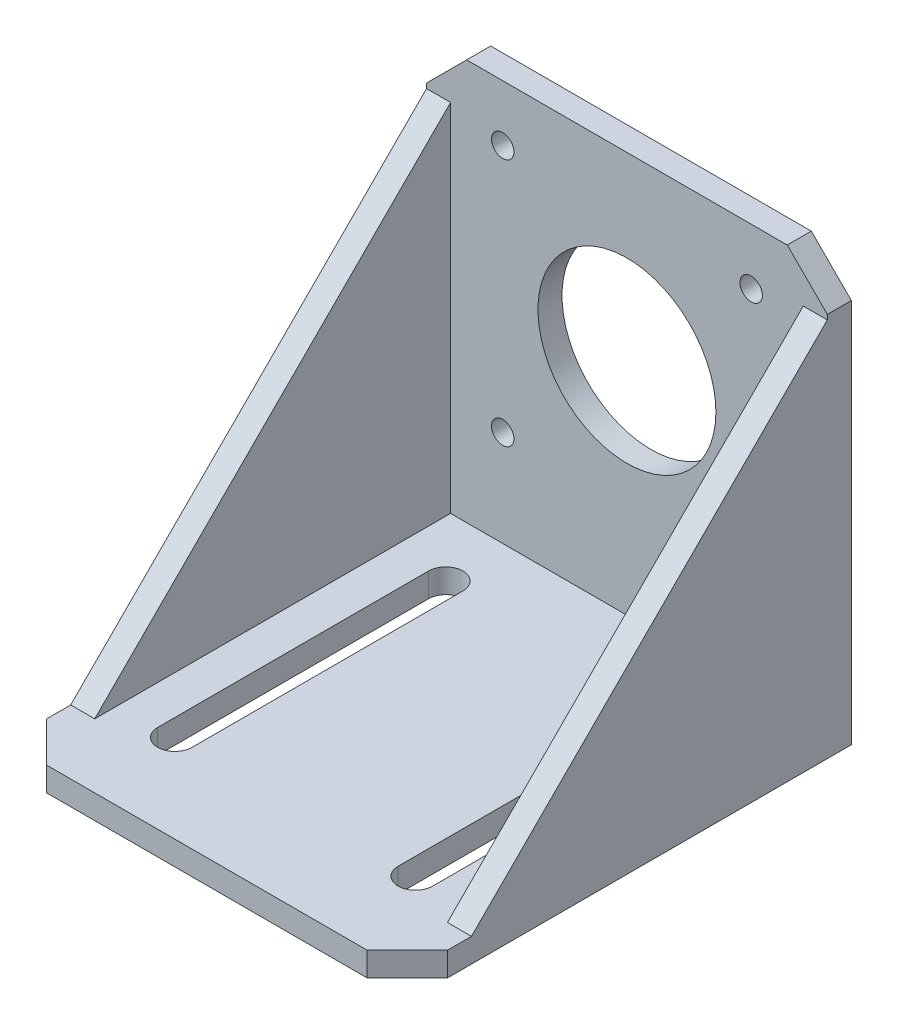
ISO-10303-21;
HEADER;
FILE_DESCRIPTION(('STEP AP214'),'2;1');
FILE_NAME('part.step','',(''),(''),'','','');
FILE_SCHEMA(('AUTOMOTIVE_DESIGN { 1 0 10303 214 1 1 1 1 }'));
ENDSEC;
DATA;
#1=APPLICATION_CONTEXT('core data for automotive mechanical design processes');
#2=APPLICATION_PROTOCOL_DEFINITION('international standard','automotive_design',2000,#1);
#3=PRODUCT_CONTEXT('',#1,'mechanical');
#4=PRODUCT('Part','Part','',(#3));
#5=PRODUCT_RELATED_PRODUCT_CATEGORY('part','',(#4));
#6=PRODUCT_DEFINITION_FORMATION('','',#4);
#7=PRODUCT_DEFINITION_CONTEXT('part definition',#1,'design');
#8=PRODUCT_DEFINITION('design','',#6,#7);
#9=PRODUCT_DEFINITION_SHAPE('','',#8);
#10=(LENGTH_UNIT() NAMED_UNIT(*) SI_UNIT(.MILLI.,.METRE.));
#11=(NAMED_UNIT(*) PLANE_ANGLE_UNIT() SI_UNIT($,.RADIAN.));
#12=(NAMED_UNIT(*) SI_UNIT($,.STERADIAN.) SOLID_ANGLE_UNIT());
#13=UNCERTAINTY_MEASURE_WITH_UNIT(LENGTH_MEASURE(1.E-05),#10,'distance_accuracy_value','');
#14=(GEOMETRIC_REPRESENTATION_CONTEXT(3) GLOBAL_UNCERTAINTY_ASSIGNED_CONTEXT((#13)) GLOBAL_UNIT_ASSIGNED_CONTEXT((#10,
#11,#12)) REPRESENTATION_CONTEXT('',''));
#15=CARTESIAN_POINT('',(0.,0.,0.));
#16=DIRECTION('',(0.,0.,1.));
#17=DIRECTION('',(1.,0.,0.));
#18=AXIS2_PLACEMENT_3D('',#15,#16,#17);
#19=CARTESIAN_POINT('',(0.,0.,3.));
#20=DIRECTION('',(0.,0.,1.));
#21=DIRECTION('',(1.,0.,0.));
#22=AXIS2_PLACEMENT_3D('',#19,#20,#21);
#23=PLANE('',#22);
#24=CARTESIAN_POINT('',(0.,0.,3.));
#25=DIRECTION('',(0.,0.,1.));
#26=DIRECTION('',(1.,0.,0.));
#27=AXIS2_PLACEMENT_3D('',#24,#25,#26);
#28=CIRCLE('',#27,11.1);
#29=CARTESIAN_POINT('',(11.1,0.,3.));
#30=VERTEX_POINT('',#29);
#31=EDGE_CURVE('E414',#30,#30,#28,.T.);
#32=ORIENTED_EDGE('',*,*,#31,.F.);
#33=EDGE_LOOP('',(#32));
#34=FACE_BOUND('',#33,.T.);
#35=CARTESIAN_POINT('',(-15.5,15.5,3.));
#36=DIRECTION('',(0.,0.,1.));
#37=DIRECTION('',(1.,0.,0.));
#38=AXIS2_PLACEMENT_3D('',#35,#36,#37);
#39=CIRCLE('',#38,1.4);
#40=CARTESIAN_POINT('',(-14.1,15.5,3.));
#41=VERTEX_POINT('',#40);
#42=EDGE_CURVE('E523',#41,#41,#39,.T.);
#43=ORIENTED_EDGE('',*,*,#42,.F.);
#44=EDGE_LOOP('',(#43));
#45=FACE_BOUND('',#44,.T.);
#46=CARTESIAN_POINT('',(15.5,15.5,3.));
#47=DIRECTION('',(0.,0.,1.));
#48=DIRECTION('',(1.,0.,0.));
#49=AXIS2_PLACEMENT_3D('',#46,#47,#48);
#50=CIRCLE('',#49,1.4);
#51=CARTESIAN_POINT('',(16.9,15.5,3.));
#52=VERTEX_POINT('',#51);
#53=EDGE_CURVE('E529',#52,#52,#50,.T.);
#54=ORIENTED_EDGE('',*,*,#53,.F.);
#55=EDGE_LOOP('',(#54));
#56=FACE_BOUND('',#55,.T.);
#57=CARTESIAN_POINT('',(15.5,-15.5,3.));
#58=DIRECTION('',(0.,0.,1.));
#59=DIRECTION('',(1.,0.,0.));
#60=AXIS2_PLACEMENT_3D('',#57,#58,#59);
#61=CIRCLE('',#60,1.4);
#62=CARTESIAN_POINT('',(16.9,-15.5,3.));
#63=VERTEX_POINT('',#62);
#64=EDGE_CURVE('E540',#63,#63,#61,.T.);
#65=ORIENTED_EDGE('',*,*,#64,.F.);
#66=EDGE_LOOP('',(#65));
#67=FACE_BOUND('',#66,.T.);
#68=CARTESIAN_POINT('',(-15.5,-15.5,3.));
#69=DIRECTION('',(0.,0.,1.));
#70=DIRECTION('',(1.,0.,0.));
#71=AXIS2_PLACEMENT_3D('',#68,#69,#70);
#72=CIRCLE('',#71,1.4);
#73=CARTESIAN_POINT('',(-14.1,-15.5,3.));
#74=VERTEX_POINT('',#73);
#75=EDGE_CURVE('E279',#74,#74,#72,.T.);
#76=ORIENTED_EDGE('',*,*,#75,.F.);
#77=EDGE_LOOP('',(#76));
#78=FACE_BOUND('',#77,.T.);
#79=DIRECTION('',(0.,-1.,0.));
#80=VECTOR('',#79,1.);
#81=CARTESIAN_POINT('',(22.,16.8999999999994,3.));
#82=LINE('',#81,#80);
#83=CARTESIAN_POINT('',(22.,16.8999999999994,3.));
#84=VERTEX_POINT('',#83);
#85=CARTESIAN_POINT('',(22.,-27.5,3.));
#86=VERTEX_POINT('',#85);
#87=EDGE_CURVE('E51',#84,#86,#82,.T.);
#88=ORIENTED_EDGE('',*,*,#87,.F.);
#89=DIRECTION('',(1.,0.,0.));
#90=VECTOR('',#89,1.);
#91=CARTESIAN_POINT('',(22.,16.8999999999994,3.));
#92=LINE('',#91,#90);
#93=CARTESIAN_POINT('',(25.,16.8999999999994,3.));
#94=VERTEX_POINT('',#93);
#95=EDGE_CURVE('E56',#84,#94,#92,.T.);
#96=ORIENTED_EDGE('',*,*,#95,.T.);
#97=DIRECTION('',(0.,1.,0.));
#98=VECTOR('',#97,1.);
#99=CARTESIAN_POINT('',(25.,17.5,3.));
#100=LINE('',#99,#98);
#101=CARTESIAN_POINT('',(25.,17.5,3.));
#102=VERTEX_POINT('',#101);
#103=EDGE_CURVE('E37',#94,#102,#100,.T.);
#104=ORIENTED_EDGE('',*,*,#103,.T.);
#105=DIRECTION('',(-0.707106781186549,0.707106781186546,0.));
#106=VECTOR('',#105,1.);
#107=CARTESIAN_POINT('',(20.,22.5,3.));
#108=LINE('',#107,#106);
#109=CARTESIAN_POINT('',(20.,22.5,3.));
#110=VERTEX_POINT('',#109);
#111=EDGE_CURVE('E406',#102,#110,#108,.T.);
#112=ORIENTED_EDGE('',*,*,#111,.T.);
#113=DIRECTION('',(-1.,0.,0.));
#114=VECTOR('',#113,1.);
#115=CARTESIAN_POINT('',(20.,22.5,3.));
#116=LINE('',#115,#114);
#117=CARTESIAN_POINT('',(-20.,22.5,3.));
#118=VERTEX_POINT('',#117);
#119=EDGE_CURVE('E408',#110,#118,#116,.T.);
#120=ORIENTED_EDGE('',*,*,#119,.T.);
#121=DIRECTION('',(-0.707106781186549,-0.707106781186546,0.));
#122=VECTOR('',#121,1.);
#123=CARTESIAN_POINT('',(-20.,22.5,3.));
#124=LINE('',#123,#122);
#125=CARTESIAN_POINT('',(-25.,17.5,3.));
#126=VERTEX_POINT('',#125);
#127=EDGE_CURVE('E400',#118,#126,#124,.T.);
#128=ORIENTED_EDGE('',*,*,#127,.T.);
#129=DIRECTION('',(0.,-1.,0.));
#130=VECTOR('',#129,1.);
#131=CARTESIAN_POINT('',(-25.,17.5,3.));
#132=LINE('',#131,#130);
#133=CARTESIAN_POINT('',(-25.,16.8999999999994,3.));
#134=VERTEX_POINT('',#133);
#135=EDGE_CURVE('E204',#126,#134,#132,.T.);
#136=ORIENTED_EDGE('',*,*,#135,.T.);
#137=DIRECTION('',(-1.,0.,0.));
#138=VECTOR('',#137,1.);
#139=CARTESIAN_POINT('',(-22.,16.8999999999994,3.));
#140=LINE('',#139,#138);
#141=CARTESIAN_POINT('',(-22.,16.8999999999994,3.));
#142=VERTEX_POINT('',#141);
#143=EDGE_CURVE('E196',#142,#134,#140,.T.);
#144=ORIENTED_EDGE('',*,*,#143,.F.);
#145=DIRECTION('',(0.,-1.,0.));
#146=VECTOR('',#145,1.);
#147=CARTESIAN_POINT('',(-22.,16.8999999999994,3.));
#148=LINE('',#147,#146);
#149=CARTESIAN_POINT('',(-22.,-27.5,3.));
#150=VERTEX_POINT('',#149);
#151=EDGE_CURVE('E186',#142,#150,#148,.T.);
#152=ORIENTED_EDGE('',*,*,#151,.T.);
#153=DIRECTION('',(-1.,0.,0.));
#154=VECTOR('',#153,1.);
#155=CARTESIAN_POINT('',(-25.,-27.5,3.));
#156=LINE('',#155,#154);
#157=EDGE_CURVE('E265',#86,#150,#156,.T.);
#158=ORIENTED_EDGE('',*,*,#157,.F.);
#159=EDGE_LOOP('',(#88,#96,#104,#112,#120,#128,#136,#144,#152,#158));
#160=FACE_BOUND('',#159,.T.);
#161=ADVANCED_FACE('F33',(#34,#45,#56,#67,#78,#160),#23,.T.);
#162=CARTESIAN_POINT('',(-25.,-27.5,55.4));
#163=DIRECTION('',(0.,-1.,0.));
#164=DIRECTION('',(0.,0.,-1.));
#165=AXIS2_PLACEMENT_3D('',#162,#163,#164);
#166=PLANE('',#165);
#167=DIRECTION('',(0.,0.,1.));
#168=VECTOR('',#167,1.);
#169=CARTESIAN_POINT('',(-12.85,-27.5,55.4));
#170=LINE('',#169,#168);
#171=CARTESIAN_POINT('',(-12.85,-27.5,10.6));
#172=VERTEX_POINT('',#171);
#173=CARTESIAN_POINT('',(-12.85,-27.5,44.4));
#174=VERTEX_POINT('',#173);
#175=EDGE_CURVE('E298',#172,#174,#170,.T.);
#176=ORIENTED_EDGE('',*,*,#175,.T.);
#177=CARTESIAN_POINT('',(-15.,-27.5,44.4));
#178=DIRECTION('',(0.,-1.,0.));
#179=DIRECTION('',(0.,0.,-1.));
#180=AXIS2_PLACEMENT_3D('',#177,#178,#179);
#181=CIRCLE('',#180,2.15);
#182=CARTESIAN_POINT('',(-17.15,-27.5,44.4));
#183=VERTEX_POINT('',#182);
#184=EDGE_CURVE('E301',#174,#183,#181,.T.);
#185=ORIENTED_EDGE('',*,*,#184,.T.);
#186=DIRECTION('',(0.,0.,-1.));
#187=VECTOR('',#186,1.);
#188=CARTESIAN_POINT('',(-17.15,-27.5,55.4));
#189=LINE('',#188,#187);
#190=CARTESIAN_POINT('',(-17.15,-27.5,10.6));
#191=VERTEX_POINT('',#190);
#192=EDGE_CURVE('E289',#183,#191,#189,.T.);
#193=ORIENTED_EDGE('',*,*,#192,.T.);
#194=CARTESIAN_POINT('',(-15.,-27.5,10.6));
#195=DIRECTION('',(0.,-1.,0.));
#196=DIRECTION('',(0.,0.,-1.));
#197=AXIS2_PLACEMENT_3D('',#194,#195,#196);
#198=CIRCLE('',#197,2.15);
#199=EDGE_CURVE('E295',#191,#172,#198,.T.);
#200=ORIENTED_EDGE('',*,*,#199,.T.);
#201=EDGE_LOOP('',(#176,#185,#193,#200));
#202=FACE_BOUND('',#201,.T.);
#203=DIRECTION('',(0.,0.,-1.));
#204=VECTOR('',#203,1.);
#205=CARTESIAN_POINT('',(12.85,-27.5,55.4));
#206=LINE('',#205,#204);
#207=CARTESIAN_POINT('',(12.85,-27.5,44.4));
#208=VERTEX_POINT('',#207);
#209=CARTESIAN_POINT('',(12.85,-27.5,10.6));
#210=VERTEX_POINT('',#209);
#211=EDGE_CURVE('E310',#208,#210,#206,.T.);
#212=ORIENTED_EDGE('',*,*,#211,.T.);
#213=CARTESIAN_POINT('',(15.,-27.5,10.6));
#214=DIRECTION('',(0.,-1.,0.));
#215=DIRECTION('',(0.,0.,-1.));
#216=AXIS2_PLACEMENT_3D('',#213,#214,#215);
#217=CIRCLE('',#216,2.15);
#218=CARTESIAN_POINT('',(17.15,-27.5,10.6));
#219=VERTEX_POINT('',#218);
#220=EDGE_CURVE('E43',#210,#219,#217,.T.);
#221=ORIENTED_EDGE('',*,*,#220,.T.);
#222=DIRECTION('',(0.,0.,1.));
#223=VECTOR('',#222,1.);
#224=CARTESIAN_POINT('',(17.15,-27.5,55.4));
#225=LINE('',#224,#223);
#226=CARTESIAN_POINT('',(17.15,-27.5,44.4));
#227=VERTEX_POINT('',#226);
#228=EDGE_CURVE('E304',#219,#227,#225,.T.);
#229=ORIENTED_EDGE('',*,*,#228,.T.);
#230=CARTESIAN_POINT('',(15.,-27.5,44.4));
#231=DIRECTION('',(0.,-1.,0.));
#232=DIRECTION('',(0.,0.,-1.));
#233=AXIS2_PLACEMENT_3D('',#230,#231,#232);
#234=CIRCLE('',#233,2.15);
#235=EDGE_CURVE('E307',#227,#208,#234,.T.);
#236=ORIENTED_EDGE('',*,*,#235,.T.);
#237=EDGE_LOOP('',(#212,#221,#229,#236));
#238=FACE_BOUND('',#237,.T.);
#239=DIRECTION('',(1.,0.,0.));
#240=VECTOR('',#239,1.);
#241=CARTESIAN_POINT('',(22.,-27.5,47.3999999999999));
#242=LINE('',#241,#240);
#243=CARTESIAN_POINT('',(22.,-27.5,47.3999999999999));
#244=VERTEX_POINT('',#243);
#245=CARTESIAN_POINT('',(25.,-27.5,47.3999999999999));
#246=VERTEX_POINT('',#245);
#247=EDGE_CURVE('E450',#244,#246,#242,.T.);
#248=ORIENTED_EDGE('',*,*,#247,.F.);
#249=DIRECTION('',(0.,0.,1.));
#250=VECTOR('',#249,1.);
#251=CARTESIAN_POINT('',(22.,-27.5,3.));
#252=LINE('',#251,#250);
#253=EDGE_CURVE('E453',#86,#244,#252,.T.);
#254=ORIENTED_EDGE('',*,*,#253,.F.);
#255=ORIENTED_EDGE('',*,*,#157,.T.);
#256=DIRECTION('',(0.,0.,1.));
#257=VECTOR('',#256,1.);
#258=CARTESIAN_POINT('',(-22.,-27.5,3.));
#259=LINE('',#258,#257);
#260=CARTESIAN_POINT('',(-22.,-27.5,47.3999999999999));
#261=VERTEX_POINT('',#260);
#262=EDGE_CURVE('E191',#150,#261,#259,.T.);
#263=ORIENTED_EDGE('',*,*,#262,.T.);
#264=DIRECTION('',(-1.,0.,0.));
#265=VECTOR('',#264,1.);
#266=CARTESIAN_POINT('',(-22.,-27.5,47.3999999999999));
#267=LINE('',#266,#265);
#268=CARTESIAN_POINT('',(-25.,-27.5,47.3999999999999));
#269=VERTEX_POINT('',#268);
#270=EDGE_CURVE('E199',#261,#269,#267,.T.);
#271=ORIENTED_EDGE('',*,*,#270,.T.);
#272=DIRECTION('',(0.,0.,-1.));
#273=VECTOR('',#272,1.);
#274=CARTESIAN_POINT('',(-25.,-27.5,55.4));
#275=LINE('',#274,#273);
#276=CARTESIAN_POINT('',(-25.,-27.5,50.3999999999999));
#277=VERTEX_POINT('',#276);
#278=EDGE_CURVE('E271',#277,#269,#275,.T.);
#279=ORIENTED_EDGE('',*,*,#278,.F.);
#280=DIRECTION('',(0.707106781186543,0.,0.707106781186552));
#281=VECTOR('',#280,1.);
#282=CARTESIAN_POINT('',(-22.5,-27.5,52.9));
#283=LINE('',#282,#281);
#284=CARTESIAN_POINT('',(-20.,-27.5,55.4));
#285=VERTEX_POINT('',#284);
#286=EDGE_CURVE('E262',#277,#285,#283,.T.);
#287=ORIENTED_EDGE('',*,*,#286,.T.);
#288=DIRECTION('',(-1.,0.,0.));
#289=VECTOR('',#288,1.);
#290=CARTESIAN_POINT('',(-25.,-27.5,55.4));
#291=LINE('',#290,#289);
#292=CARTESIAN_POINT('',(20.,-27.5,55.4));
#293=VERTEX_POINT('',#292);
#294=EDGE_CURVE('E269',#293,#285,#291,.T.);
#295=ORIENTED_EDGE('',*,*,#294,.F.);
#296=DIRECTION('',(0.707106781186544,0.,-0.707106781186551));
#297=VECTOR('',#296,1.);
#298=CARTESIAN_POINT('',(-2.49999999999975,-27.5,77.9));
#299=LINE('',#298,#297);
#300=CARTESIAN_POINT('',(24.9999999999999,-27.5,50.4000000000001));
#301=VERTEX_POINT('',#300);
#302=EDGE_CURVE('E215',#293,#301,#299,.T.);
#303=ORIENTED_EDGE('',*,*,#302,.T.);
#304=DIRECTION('',(0.,0.,-1.));
#305=VECTOR('',#304,1.);
#306=CARTESIAN_POINT('',(25.,-27.5,55.4));
#307=LINE('',#306,#305);
#308=EDGE_CURVE('E277',#301,#246,#307,.T.);
#309=ORIENTED_EDGE('',*,*,#308,.T.);
#310=EDGE_LOOP('',(#248,#254,#255,#263,#271,#279,#287,#295,#303,#309));
#311=FACE_BOUND('',#310,.T.);
#312=ADVANCED_FACE('F314',(#202,#238,#311),#166,.F.);
#313=CARTESIAN_POINT('',(0.,0.,0.));
#314=DIRECTION('',(0.,0.,1.));
#315=DIRECTION('',(1.,0.,0.));
#316=AXIS2_PLACEMENT_3D('',#313,#314,#315);
#317=PLANE('',#316);
#318=CARTESIAN_POINT('',(-15.5,-15.5,0.));
#319=DIRECTION('',(0.,0.,1.));
#320=DIRECTION('',(1.,0.,0.));
#321=AXIS2_PLACEMENT_3D('',#318,#319,#320);
#322=CIRCLE('',#321,1.4);
#323=CARTESIAN_POINT('',(-14.1,-15.5,0.));
#324=VERTEX_POINT('',#323);
#325=EDGE_CURVE('E274',#324,#324,#322,.T.);
#326=ORIENTED_EDGE('',*,*,#325,.T.);
#327=EDGE_LOOP('',(#326));
#328=FACE_BOUND('',#327,.T.);
#329=CARTESIAN_POINT('',(15.5,-15.5,0.));
#330=DIRECTION('',(0.,0.,1.));
#331=DIRECTION('',(1.,0.,0.));
#332=AXIS2_PLACEMENT_3D('',#329,#330,#331);
#333=CIRCLE('',#332,1.4);
#334=CARTESIAN_POINT('',(16.9,-15.5,0.));
#335=VERTEX_POINT('',#334);
#336=EDGE_CURVE('E538',#335,#335,#333,.T.);
#337=ORIENTED_EDGE('',*,*,#336,.T.);
#338=EDGE_LOOP('',(#337));
#339=FACE_BOUND('',#338,.T.);
#340=CARTESIAN_POINT('',(15.5,15.5,0.));
#341=DIRECTION('',(0.,0.,1.));
#342=DIRECTION('',(1.,0.,0.));
#343=AXIS2_PLACEMENT_3D('',#340,#341,#342);
#344=CIRCLE('',#343,1.4);
#345=CARTESIAN_POINT('',(16.9,15.5,0.));
#346=VERTEX_POINT('',#345);
#347=EDGE_CURVE('E524',#346,#346,#344,.T.);
#348=ORIENTED_EDGE('',*,*,#347,.T.);
#349=EDGE_LOOP('',(#348));
#350=FACE_BOUND('',#349,.T.);
#351=CARTESIAN_POINT('',(-15.5,15.5,0.));
#352=DIRECTION('',(0.,0.,1.));
#353=DIRECTION('',(1.,0.,0.));
#354=AXIS2_PLACEMENT_3D('',#351,#352,#353);
#355=CIRCLE('',#354,1.4);
#356=CARTESIAN_POINT('',(-14.1,15.5,0.));
#357=VERTEX_POINT('',#356);
#358=EDGE_CURVE('E520',#357,#357,#355,.T.);
#359=ORIENTED_EDGE('',*,*,#358,.T.);
#360=EDGE_LOOP('',(#359));
#361=FACE_BOUND('',#360,.T.);
#362=DIRECTION('',(-0.707106781186549,-0.707106781186546,0.));
#363=VECTOR('',#362,1.);
#364=CARTESIAN_POINT('',(-20.,22.5,0.));
#365=LINE('',#364,#363);
#366=CARTESIAN_POINT('',(-20.,22.5,0.));
#367=VERTEX_POINT('',#366);
#368=CARTESIAN_POINT('',(-25.,17.5,0.));
#369=VERTEX_POINT('',#368);
#370=EDGE_CURVE('E411',#367,#369,#365,.T.);
#371=ORIENTED_EDGE('',*,*,#370,.F.);
#372=DIRECTION('',(-1.,0.,0.));
#373=VECTOR('',#372,1.);
#374=CARTESIAN_POINT('',(20.,22.5,0.));
#375=LINE('',#374,#373);
#376=CARTESIAN_POINT('',(20.,22.5,0.));
#377=VERTEX_POINT('',#376);
#378=EDGE_CURVE('E422',#377,#367,#375,.T.);
#379=ORIENTED_EDGE('',*,*,#378,.F.);
#380=DIRECTION('',(-0.707106781186549,0.707106781186546,0.));
#381=VECTOR('',#380,1.);
#382=CARTESIAN_POINT('',(20.,22.5,0.));
#383=LINE('',#382,#381);
#384=CARTESIAN_POINT('',(25.,17.5,0.));
#385=VERTEX_POINT('',#384);
#386=EDGE_CURVE('E420',#385,#377,#383,.T.);
#387=ORIENTED_EDGE('',*,*,#386,.F.);
#388=DIRECTION('',(0.,1.,0.));
#389=VECTOR('',#388,1.);
#390=CARTESIAN_POINT('',(25.,17.5,0.));
#391=LINE('',#390,#389);
#392=CARTESIAN_POINT('',(25.,-30.5,0.));
#393=VERTEX_POINT('',#392);
#394=EDGE_CURVE('E418',#393,#385,#391,.T.);
#395=ORIENTED_EDGE('',*,*,#394,.F.);
#396=DIRECTION('',(1.,0.,0.));
#397=VECTOR('',#396,1.);
#398=CARTESIAN_POINT('',(-25.,-30.5,0.));
#399=LINE('',#398,#397);
#400=CARTESIAN_POINT('',(-25.,-30.5,0.));
#401=VERTEX_POINT('',#400);
#402=EDGE_CURVE('E416',#401,#393,#399,.T.);
#403=ORIENTED_EDGE('',*,*,#402,.F.);
#404=DIRECTION('',(0.,-1.,0.));
#405=VECTOR('',#404,1.);
#406=CARTESIAN_POINT('',(-25.,17.5,0.));
#407=LINE('',#406,#405);
#408=EDGE_CURVE('E388',#369,#401,#407,.T.);
#409=ORIENTED_EDGE('',*,*,#408,.F.);
#410=EDGE_LOOP('',(#371,#379,#387,#395,#403,#409));
#411=FACE_BOUND('',#410,.T.);
#412=CARTESIAN_POINT('',(0.,0.,0.));
#413=DIRECTION('',(0.,0.,1.));
#414=DIRECTION('',(1.,0.,0.));
#415=AXIS2_PLACEMENT_3D('',#412,#413,#414);
#416=CIRCLE('',#415,11.1);
#417=CARTESIAN_POINT('',(11.1,0.,0.));
#418=VERTEX_POINT('',#417);
#419=EDGE_CURVE('E526',#418,#418,#416,.T.);
#420=ORIENTED_EDGE('',*,*,#419,.T.);
#421=EDGE_LOOP('',(#420));
#422=FACE_BOUND('',#421,.T.);
#423=ADVANCED_FACE('F350',(#328,#339,#350,#361,#411,#422),#317,.F.);
#424=CARTESIAN_POINT('',(-20.,22.5,3.));
#425=DIRECTION('',(0.707106781186546,-0.707106781186549,0.));
#426=DIRECTION('',(0.707106781186549,0.707106781186546,0.));
#427=AXIS2_PLACEMENT_3D('',#424,#425,#426);
#428=PLANE('',#427);
#429=ORIENTED_EDGE('',*,*,#370,.T.);
#430=DIRECTION('',(0.,0.,-1.));
#431=VECTOR('',#430,1.);
#432=CARTESIAN_POINT('',(-25.,17.5,3.));
#433=LINE('',#432,#431);
#434=EDGE_CURVE('E290',#126,#369,#433,.T.);
#435=ORIENTED_EDGE('',*,*,#434,.F.);
#436=ORIENTED_EDGE('',*,*,#127,.F.);
#437=DIRECTION('',(0.,0.,-1.));
#438=VECTOR('',#437,1.);
#439=CARTESIAN_POINT('',(-20.,22.5,3.));
#440=LINE('',#439,#438);
#441=EDGE_CURVE('E410',#118,#367,#440,.T.);
#442=ORIENTED_EDGE('',*,*,#441,.T.);
#443=EDGE_LOOP('',(#429,#435,#436,#442));
#444=FACE_BOUND('',#443,.T.);
#445=ADVANCED_FACE('F35',(#444),#428,.F.);
#446=CARTESIAN_POINT('',(-25.,17.5,3.));
#447=DIRECTION('',(1.,0.,0.));
#448=DIRECTION('',(0.,1.,0.));
#449=AXIS2_PLACEMENT_3D('',#446,#447,#448);
#450=PLANE('',#449);
#451=DIRECTION('',(0.,0.,-1.));
#452=VECTOR('',#451,1.);
#453=CARTESIAN_POINT('',(-25.,-30.5,3.));
#454=LINE('',#453,#452);
#455=CARTESIAN_POINT('',(-25.,-30.5,50.3999999999999));
#456=VERTEX_POINT('',#455);
#457=EDGE_CURVE('E385',#456,#401,#454,.T.);
#458=ORIENTED_EDGE('',*,*,#457,.F.);
#459=DIRECTION('',(0.,-1.,0.));
#460=VECTOR('',#459,1.);
#461=CARTESIAN_POINT('',(-25.,22.5,50.3999999999999));
#462=LINE('',#461,#460);
#463=EDGE_CURVE('E260',#277,#456,#462,.T.);
#464=ORIENTED_EDGE('',*,*,#463,.F.);
#465=ORIENTED_EDGE('',*,*,#278,.T.);
#466=DIRECTION('',(0.,0.707106781186543,-0.707106781186552));
#467=VECTOR('',#466,1.);
#468=CARTESIAN_POINT('',(-25.,-27.5,47.3999999999999));
#469=LINE('',#468,#467);
#470=EDGE_CURVE('E200',#269,#134,#469,.T.);
#471=ORIENTED_EDGE('',*,*,#470,.T.);
#472=ORIENTED_EDGE('',*,*,#135,.F.);
#473=ORIENTED_EDGE('',*,*,#434,.T.);
#474=ORIENTED_EDGE('',*,*,#408,.T.);
#475=EDGE_LOOP('',(#458,#464,#465,#471,#472,#473,#474));
#476=FACE_BOUND('',#475,.T.);
#477=ADVANCED_FACE('F375',(#476),#450,.F.);
#478=CARTESIAN_POINT('',(-25.,-30.5,3.));
#479=DIRECTION('',(0.,1.,0.));
#480=DIRECTION('',(0.,0.,1.));
#481=AXIS2_PLACEMENT_3D('',#478,#479,#480);
#482=PLANE('',#481);
#483=DIRECTION('',(0.,0.,1.));
#484=VECTOR('',#483,1.);
#485=CARTESIAN_POINT('',(17.15,-30.5,44.4));
#486=LINE('',#485,#484);
#487=CARTESIAN_POINT('',(17.15,-30.5,10.6));
#488=VERTEX_POINT('',#487);
#489=CARTESIAN_POINT('',(17.15,-30.5,44.4));
#490=VERTEX_POINT('',#489);
#491=EDGE_CURVE('E220',#488,#490,#486,.T.);
#492=ORIENTED_EDGE('',*,*,#491,.F.);
#493=CARTESIAN_POINT('',(15.,-30.5,10.6));
#494=DIRECTION('',(0.,-1.,0.));
#495=DIRECTION('',(0.,0.,1.));
#496=AXIS2_PLACEMENT_3D('',#493,#494,#495);
#497=CIRCLE('',#496,2.15);
#498=CARTESIAN_POINT('',(12.85,-30.5,10.6));
#499=VERTEX_POINT('',#498);
#500=EDGE_CURVE('E218',#499,#488,#497,.T.);
#501=ORIENTED_EDGE('',*,*,#500,.F.);
#502=DIRECTION('',(0.,0.,-1.));
#503=VECTOR('',#502,1.);
#504=CARTESIAN_POINT('',(12.85,-30.5,44.4));
#505=LINE('',#504,#503);
#506=CARTESIAN_POINT('',(12.85,-30.5,44.4));
#507=VERTEX_POINT('',#506);
#508=EDGE_CURVE('E226',#507,#499,#505,.T.);
#509=ORIENTED_EDGE('',*,*,#508,.F.);
#510=CARTESIAN_POINT('',(15.,-30.5,44.4));
#511=DIRECTION('',(0.,-1.,0.));
#512=DIRECTION('',(0.,0.,1.));
#513=AXIS2_PLACEMENT_3D('',#510,#511,#512);
#514=CIRCLE('',#513,2.15);
#515=EDGE_CURVE('E223',#490,#507,#514,.T.);
#516=ORIENTED_EDGE('',*,*,#515,.F.);
#517=EDGE_LOOP('',(#492,#501,#509,#516));
#518=FACE_BOUND('',#517,.T.);
#519=DIRECTION('',(0.,0.,-1.));
#520=VECTOR('',#519,1.);
#521=CARTESIAN_POINT('',(-17.15,-30.5,44.4));
#522=LINE('',#521,#520);
#523=CARTESIAN_POINT('',(-17.15,-30.5,44.4));
#524=VERTEX_POINT('',#523);
#525=CARTESIAN_POINT('',(-17.15,-30.5,10.6));
#526=VERTEX_POINT('',#525);
#527=EDGE_CURVE('E240',#524,#526,#522,.T.);
#528=ORIENTED_EDGE('',*,*,#527,.F.);
#529=CARTESIAN_POINT('',(-15.,-30.5,44.4));
#530=DIRECTION('',(0.,-1.,0.));
#531=DIRECTION('',(0.,0.,-1.));
#532=AXIS2_PLACEMENT_3D('',#529,#530,#531);
#533=CIRCLE('',#532,2.15);
#534=CARTESIAN_POINT('',(-12.85,-30.5,44.4));
#535=VERTEX_POINT('',#534);
#536=EDGE_CURVE('E232',#535,#524,#533,.T.);
#537=ORIENTED_EDGE('',*,*,#536,.F.);
#538=DIRECTION('',(0.,0.,1.));
#539=VECTOR('',#538,1.);
#540=CARTESIAN_POINT('',(-12.85,-30.5,44.4));
#541=LINE('',#540,#539);
#542=CARTESIAN_POINT('',(-12.85,-30.5,10.6));
#543=VERTEX_POINT('',#542);
#544=EDGE_CURVE('E246',#543,#535,#541,.T.);
#545=ORIENTED_EDGE('',*,*,#544,.F.);
#546=CARTESIAN_POINT('',(-15.,-30.5,10.6));
#547=DIRECTION('',(0.,-1.,0.));
#548=DIRECTION('',(0.,0.,-1.));
#549=AXIS2_PLACEMENT_3D('',#546,#547,#548);
#550=CIRCLE('',#549,2.15);
#551=EDGE_CURVE('E243',#526,#543,#550,.T.);
#552=ORIENTED_EDGE('',*,*,#551,.F.);
#553=EDGE_LOOP('',(#528,#537,#545,#552));
#554=FACE_BOUND('',#553,.T.);
#555=DIRECTION('',(0.,0.,-1.));
#556=VECTOR('',#555,1.);
#557=CARTESIAN_POINT('',(25.,-30.5,3.));
#558=LINE('',#557,#556);
#559=CARTESIAN_POINT('',(24.9999999999999,-30.5,50.4000000000001));
#560=VERTEX_POINT('',#559);
#561=EDGE_CURVE('E393',#560,#393,#558,.T.);
#562=ORIENTED_EDGE('',*,*,#561,.F.);
#563=DIRECTION('',(0.707106781186544,0.,-0.707106781186551));
#564=VECTOR('',#563,1.);
#565=CARTESIAN_POINT('',(24.9999999999999,-30.5,50.4000000000001));
#566=LINE('',#565,#564);
#567=CARTESIAN_POINT('',(20.,-30.5,55.4));
#568=VERTEX_POINT('',#567);
#569=EDGE_CURVE('E206',#568,#560,#566,.T.);
#570=ORIENTED_EDGE('',*,*,#569,.F.);
#571=DIRECTION('',(1.,0.,0.));
#572=VECTOR('',#571,1.);
#573=CARTESIAN_POINT('',(-25.,-30.5,55.4));
#574=LINE('',#573,#572);
#575=CARTESIAN_POINT('',(-20.,-30.5,55.4));
#576=VERTEX_POINT('',#575);
#577=EDGE_CURVE('E266',#576,#568,#574,.T.);
#578=ORIENTED_EDGE('',*,*,#577,.F.);
#579=DIRECTION('',(0.707106781186543,0.,0.707106781186552));
#580=VECTOR('',#579,1.);
#581=CARTESIAN_POINT('',(-25.,-30.5,50.3999999999999));
#582=LINE('',#581,#580);
#583=EDGE_CURVE('E252',#456,#576,#582,.T.);
#584=ORIENTED_EDGE('',*,*,#583,.F.);
#585=ORIENTED_EDGE('',*,*,#457,.T.);
#586=ORIENTED_EDGE('',*,*,#402,.T.);
#587=EDGE_LOOP('',(#562,#570,#578,#584,#585,#586));
#588=FACE_BOUND('',#587,.T.);
#589=ADVANCED_FACE('F328',(#518,#554,#588),#482,.F.);
#590=CARTESIAN_POINT('',(25.,17.5,3.));
#591=DIRECTION('',(-1.,0.,0.));
#592=DIRECTION('',(0.,-1.,0.));
#593=AXIS2_PLACEMENT_3D('',#590,#591,#592);
#594=PLANE('',#593);
#595=ORIENTED_EDGE('',*,*,#103,.F.);
#596=DIRECTION('',(0.,0.707106781186543,-0.707106781186552));
#597=VECTOR('',#596,1.);
#598=CARTESIAN_POINT('',(25.,-27.5,47.3999999999999));
#599=LINE('',#598,#597);
#600=EDGE_CURVE('E445',#246,#94,#599,.T.);
#601=ORIENTED_EDGE('',*,*,#600,.F.);
#602=ORIENTED_EDGE('',*,*,#308,.F.);
#603=DIRECTION('',(0.,-1.,0.));
#604=VECTOR('',#603,1.);
#605=CARTESIAN_POINT('',(24.9999999999999,22.5,50.4000000000001));
#606=LINE('',#605,#604);
#607=EDGE_CURVE('E212',#301,#560,#606,.T.);
#608=ORIENTED_EDGE('',*,*,#607,.T.);
#609=ORIENTED_EDGE('',*,*,#561,.T.);
#610=ORIENTED_EDGE('',*,*,#394,.T.);
#611=DIRECTION('',(0.,0.,-1.));
#612=VECTOR('',#611,1.);
#613=CARTESIAN_POINT('',(25.,17.5,3.));
#614=LINE('',#613,#612);
#615=EDGE_CURVE('E396',#102,#385,#614,.T.);
#616=ORIENTED_EDGE('',*,*,#615,.F.);
#617=EDGE_LOOP('',(#595,#601,#602,#608,#609,#610,#616));
#618=FACE_BOUND('',#617,.T.);
#619=ADVANCED_FACE('F369',(#618),#594,.F.);
#620=CARTESIAN_POINT('',(20.,22.5,3.));
#621=DIRECTION('',(-0.707106781186546,-0.707106781186549,0.));
#622=DIRECTION('',(0.707106781186549,-0.707106781186546,0.));
#623=AXIS2_PLACEMENT_3D('',#620,#621,#622);
#624=PLANE('',#623);
#625=ORIENTED_EDGE('',*,*,#386,.T.);
#626=DIRECTION('',(0.,0.,-1.));
#627=VECTOR('',#626,1.);
#628=CARTESIAN_POINT('',(20.,22.5,3.));
#629=LINE('',#628,#627);
#630=EDGE_CURVE('E426',#110,#377,#629,.T.);
#631=ORIENTED_EDGE('',*,*,#630,.F.);
#632=ORIENTED_EDGE('',*,*,#111,.F.);
#633=ORIENTED_EDGE('',*,*,#615,.T.);
#634=EDGE_LOOP('',(#625,#631,#632,#633));
#635=FACE_BOUND('',#634,.T.);
#636=ADVANCED_FACE('F365',(#635),#624,.F.);
#637=CARTESIAN_POINT('',(20.,22.5,3.));
#638=DIRECTION('',(0.,-1.,0.));
#639=DIRECTION('',(0.,0.,-1.));
#640=AXIS2_PLACEMENT_3D('',#637,#638,#639);
#641=PLANE('',#640);
#642=ORIENTED_EDGE('',*,*,#378,.T.);
#643=ORIENTED_EDGE('',*,*,#441,.F.);
#644=ORIENTED_EDGE('',*,*,#119,.F.);
#645=ORIENTED_EDGE('',*,*,#630,.T.);
#646=EDGE_LOOP('',(#642,#643,#644,#645));
#647=FACE_BOUND('',#646,.T.);
#648=ADVANCED_FACE('F362',(#647),#641,.F.);
#649=CARTESIAN_POINT('',(0.,0.,3.));
#650=DIRECTION('',(0.,0.,-1.));
#651=DIRECTION('',(-1.,0.,0.));
#652=AXIS2_PLACEMENT_3D('',#649,#650,#651);
#653=CYLINDRICAL_SURFACE('',#652,11.1);
#654=ORIENTED_EDGE('',*,*,#31,.T.);
#655=EDGE_LOOP('',(#654));
#656=FACE_BOUND('',#655,.T.);
#657=ORIENTED_EDGE('',*,*,#419,.F.);
#658=EDGE_LOOP('',(#657));
#659=FACE_BOUND('',#658,.T.);
#660=ADVANCED_FACE('F357',(#656,#659),#653,.F.);
#661=CARTESIAN_POINT('',(-15.5,15.5,0.));
#662=DIRECTION('',(0.,0.,1.));
#663=DIRECTION('',(1.,0.,0.));
#664=AXIS2_PLACEMENT_3D('',#661,#662,#663);
#665=CYLINDRICAL_SURFACE('',#664,1.4);
#666=ORIENTED_EDGE('',*,*,#358,.F.);
#667=EDGE_LOOP('',(#666));
#668=FACE_BOUND('',#667,.T.);
#669=ORIENTED_EDGE('',*,*,#42,.T.);
#670=EDGE_LOOP('',(#669));
#671=FACE_BOUND('',#670,.T.);
#672=ADVANCED_FACE('F509',(#668,#671),#665,.F.);
#673=CARTESIAN_POINT('',(15.5,15.5,0.));
#674=DIRECTION('',(0.,0.,1.));
#675=DIRECTION('',(1.,0.,0.));
#676=AXIS2_PLACEMENT_3D('',#673,#674,#675);
#677=CYLINDRICAL_SURFACE('',#676,1.4);
#678=ORIENTED_EDGE('',*,*,#347,.F.);
#679=EDGE_LOOP('',(#678));
#680=FACE_BOUND('',#679,.T.);
#681=ORIENTED_EDGE('',*,*,#53,.T.);
#682=EDGE_LOOP('',(#681));
#683=FACE_BOUND('',#682,.T.);
#684=ADVANCED_FACE('F506',(#680,#683),#677,.F.);
#685=CARTESIAN_POINT('',(15.5,-15.5,0.));
#686=DIRECTION('',(0.,0.,1.));
#687=DIRECTION('',(1.,0.,0.));
#688=AXIS2_PLACEMENT_3D('',#685,#686,#687);
#689=CYLINDRICAL_SURFACE('',#688,1.4);
#690=ORIENTED_EDGE('',*,*,#336,.F.);
#691=EDGE_LOOP('',(#690));
#692=FACE_BOUND('',#691,.T.);
#693=ORIENTED_EDGE('',*,*,#64,.T.);
#694=EDGE_LOOP('',(#693));
#695=FACE_BOUND('',#694,.T.);
#696=ADVANCED_FACE('F502',(#692,#695),#689,.F.);
#697=CARTESIAN_POINT('',(-15.5,-15.5,0.));
#698=DIRECTION('',(0.,0.,1.));
#699=DIRECTION('',(1.,0.,0.));
#700=AXIS2_PLACEMENT_3D('',#697,#698,#699);
#701=CYLINDRICAL_SURFACE('',#700,1.4);
#702=ORIENTED_EDGE('',*,*,#325,.F.);
#703=EDGE_LOOP('',(#702));
#704=FACE_BOUND('',#703,.T.);
#705=ORIENTED_EDGE('',*,*,#75,.T.);
#706=EDGE_LOOP('',(#705));
#707=FACE_BOUND('',#706,.T.);
#708=ADVANCED_FACE('F496',(#704,#707),#701,.F.);
#709=CARTESIAN_POINT('',(0.,0.,55.4));
#710=DIRECTION('',(0.,0.,-1.));
#711=DIRECTION('',(-1.,0.,0.));
#712=AXIS2_PLACEMENT_3D('',#709,#710,#711);
#713=PLANE('',#712);
#714=ORIENTED_EDGE('',*,*,#577,.T.);
#715=DIRECTION('',(0.,1.,0.));
#716=VECTOR('',#715,1.);
#717=CARTESIAN_POINT('',(20.,0.,55.4));
#718=LINE('',#717,#716);
#719=EDGE_CURVE('E11',#568,#293,#718,.T.);
#720=ORIENTED_EDGE('',*,*,#719,.T.);
#721=ORIENTED_EDGE('',*,*,#294,.T.);
#722=DIRECTION('',(0.,-1.,0.));
#723=VECTOR('',#722,1.);
#724=CARTESIAN_POINT('',(-20.,0.,55.4));
#725=LINE('',#724,#723);
#726=EDGE_CURVE('E286',#285,#576,#725,.T.);
#727=ORIENTED_EDGE('',*,*,#726,.T.);
#728=EDGE_LOOP('',(#714,#720,#721,#727));
#729=FACE_BOUND('',#728,.T.);
#730=ADVANCED_FACE('F482',(#729),#713,.F.);
#731=CARTESIAN_POINT('',(-25.,22.5,50.3999999999999));
#732=DIRECTION('',(0.707106781186552,0.,-0.707106781186543));
#733=DIRECTION('',(-0.707106781186543,0.,-0.707106781186552));
#734=AXIS2_PLACEMENT_3D('',#731,#732,#733);
#735=PLANE('',#734);
#736=ORIENTED_EDGE('',*,*,#463,.T.);
#737=ORIENTED_EDGE('',*,*,#583,.T.);
#738=ORIENTED_EDGE('',*,*,#726,.F.);
#739=ORIENTED_EDGE('',*,*,#286,.F.);
#740=EDGE_LOOP('',(#736,#737,#738,#739));
#741=FACE_BOUND('',#740,.T.);
#742=ADVANCED_FACE('F485',(#741),#735,.F.);
#743=CARTESIAN_POINT('',(-15.,22.5,44.4));
#744=DIRECTION('',(0.,-1.,0.));
#745=DIRECTION('',(0.,0.,-1.));
#746=AXIS2_PLACEMENT_3D('',#743,#744,#745);
#747=CYLINDRICAL_SURFACE('',#746,2.15);
#748=DIRECTION('',(0.,-1.,0.));
#749=VECTOR('',#748,1.);
#750=CARTESIAN_POINT('',(-12.85,22.5,44.4));
#751=LINE('',#750,#749);
#752=EDGE_CURVE('E250',#174,#535,#751,.T.);
#753=ORIENTED_EDGE('',*,*,#752,.T.);
#754=ORIENTED_EDGE('',*,*,#536,.T.);
#755=DIRECTION('',(0.,-1.,0.));
#756=VECTOR('',#755,1.);
#757=CARTESIAN_POINT('',(-17.15,22.5,44.4));
#758=LINE('',#757,#756);
#759=EDGE_CURVE('E249',#183,#524,#758,.T.);
#760=ORIENTED_EDGE('',*,*,#759,.F.);
#761=ORIENTED_EDGE('',*,*,#184,.F.);
#762=EDGE_LOOP('',(#753,#754,#760,#761));
#763=FACE_BOUND('',#762,.T.);
#764=ADVANCED_FACE('F487',(#763),#747,.F.);
#765=CARTESIAN_POINT('',(-12.85,22.5,44.4));
#766=DIRECTION('',(1.,0.,0.));
#767=DIRECTION('',(0.,0.,-1.));
#768=AXIS2_PLACEMENT_3D('',#765,#766,#767);
#769=PLANE('',#768);
#770=DIRECTION('',(0.,-1.,0.));
#771=VECTOR('',#770,1.);
#772=CARTESIAN_POINT('',(-12.85,22.5,10.6));
#773=LINE('',#772,#771);
#774=EDGE_CURVE('E253',#172,#543,#773,.T.);
#775=ORIENTED_EDGE('',*,*,#774,.T.);
#776=ORIENTED_EDGE('',*,*,#544,.T.);
#777=ORIENTED_EDGE('',*,*,#752,.F.);
#778=ORIENTED_EDGE('',*,*,#175,.F.);
#779=EDGE_LOOP('',(#775,#776,#777,#778));
#780=FACE_BOUND('',#779,.T.);
#781=ADVANCED_FACE('F493',(#780),#769,.F.);
#782=CARTESIAN_POINT('',(-15.,22.5,10.6));
#783=DIRECTION('',(0.,-1.,0.));
#784=DIRECTION('',(0.,0.,-1.));
#785=AXIS2_PLACEMENT_3D('',#782,#783,#784);
#786=CYLINDRICAL_SURFACE('',#785,2.15);
#787=DIRECTION('',(0.,-1.,0.));
#788=VECTOR('',#787,1.);
#789=CARTESIAN_POINT('',(-17.15,22.5,10.6));
#790=LINE('',#789,#788);
#791=EDGE_CURVE('E255',#191,#526,#790,.T.);
#792=ORIENTED_EDGE('',*,*,#791,.T.);
#793=ORIENTED_EDGE('',*,*,#551,.T.);
#794=ORIENTED_EDGE('',*,*,#774,.F.);
#795=ORIENTED_EDGE('',*,*,#199,.F.);
#796=EDGE_LOOP('',(#792,#793,#794,#795));
#797=FACE_BOUND('',#796,.T.);
#798=ADVANCED_FACE('F615',(#797),#786,.F.);
#799=CARTESIAN_POINT('',(-17.15,22.5,44.4));
#800=DIRECTION('',(-1.,0.,0.));
#801=DIRECTION('',(0.,0.,1.));
#802=AXIS2_PLACEMENT_3D('',#799,#800,#801);
#803=PLANE('',#802);
#804=ORIENTED_EDGE('',*,*,#759,.T.);
#805=ORIENTED_EDGE('',*,*,#527,.T.);
#806=ORIENTED_EDGE('',*,*,#791,.F.);
#807=ORIENTED_EDGE('',*,*,#192,.F.);
#808=EDGE_LOOP('',(#804,#805,#806,#807));
#809=FACE_BOUND('',#808,.T.);
#810=ADVANCED_FACE('F625',(#809),#803,.F.);
#811=CARTESIAN_POINT('',(15.,22.5,10.6));
#812=DIRECTION('',(0.,-1.,0.));
#813=DIRECTION('',(0.,0.,-1.));
#814=AXIS2_PLACEMENT_3D('',#811,#812,#813);
#815=CYLINDRICAL_SURFACE('',#814,2.15);
#816=DIRECTION('',(0.,-1.,0.));
#817=VECTOR('',#816,1.);
#818=CARTESIAN_POINT('',(12.85,22.5,10.6));
#819=LINE('',#818,#817);
#820=EDGE_CURVE('E230',#210,#499,#819,.T.);
#821=ORIENTED_EDGE('',*,*,#820,.T.);
#822=ORIENTED_EDGE('',*,*,#500,.T.);
#823=DIRECTION('',(0.,-1.,0.));
#824=VECTOR('',#823,1.);
#825=CARTESIAN_POINT('',(17.15,22.5,10.6));
#826=LINE('',#825,#824);
#827=EDGE_CURVE('E229',#219,#488,#826,.T.);
#828=ORIENTED_EDGE('',*,*,#827,.F.);
#829=ORIENTED_EDGE('',*,*,#220,.F.);
#830=EDGE_LOOP('',(#821,#822,#828,#829));
#831=FACE_BOUND('',#830,.T.);
#832=ADVANCED_FACE('F319',(#831),#815,.F.);
#833=CARTESIAN_POINT('',(12.85,22.5,44.4));
#834=DIRECTION('',(-1.,0.,0.));
#835=DIRECTION('',(0.,0.,1.));
#836=AXIS2_PLACEMENT_3D('',#833,#834,#835);
#837=PLANE('',#836);
#838=DIRECTION('',(0.,-1.,0.));
#839=VECTOR('',#838,1.);
#840=CARTESIAN_POINT('',(12.85,22.5,44.4));
#841=LINE('',#840,#839);
#842=EDGE_CURVE('E233',#208,#507,#841,.T.);
#843=ORIENTED_EDGE('',*,*,#842,.T.);
#844=ORIENTED_EDGE('',*,*,#508,.T.);
#845=ORIENTED_EDGE('',*,*,#820,.F.);
#846=ORIENTED_EDGE('',*,*,#211,.F.);
#847=EDGE_LOOP('',(#843,#844,#845,#846));
#848=FACE_BOUND('',#847,.T.);
#849=ADVANCED_FACE('F321',(#848),#837,.F.);
#850=CARTESIAN_POINT('',(15.,22.5,44.4));
#851=DIRECTION('',(0.,-1.,0.));
#852=DIRECTION('',(0.,0.,-1.));
#853=AXIS2_PLACEMENT_3D('',#850,#851,#852);
#854=CYLINDRICAL_SURFACE('',#853,2.15);
#855=DIRECTION('',(0.,-1.,0.));
#856=VECTOR('',#855,1.);
#857=CARTESIAN_POINT('',(17.15,22.5,44.4));
#858=LINE('',#857,#856);
#859=EDGE_CURVE('E235',#227,#490,#858,.T.);
#860=ORIENTED_EDGE('',*,*,#859,.T.);
#861=ORIENTED_EDGE('',*,*,#515,.T.);
#862=ORIENTED_EDGE('',*,*,#842,.F.);
#863=ORIENTED_EDGE('',*,*,#235,.F.);
#864=EDGE_LOOP('',(#860,#861,#862,#863));
#865=FACE_BOUND('',#864,.T.);
#866=ADVANCED_FACE('F334',(#865),#854,.F.);
#867=CARTESIAN_POINT('',(17.15,22.5,44.4));
#868=DIRECTION('',(1.,0.,0.));
#869=DIRECTION('',(0.,0.,-1.));
#870=AXIS2_PLACEMENT_3D('',#867,#868,#869);
#871=PLANE('',#870);
#872=ORIENTED_EDGE('',*,*,#827,.T.);
#873=ORIENTED_EDGE('',*,*,#491,.T.);
#874=ORIENTED_EDGE('',*,*,#859,.F.);
#875=ORIENTED_EDGE('',*,*,#228,.F.);
#876=EDGE_LOOP('',(#872,#873,#874,#875));
#877=FACE_BOUND('',#876,.T.);
#878=ADVANCED_FACE('F331',(#877),#871,.F.);
#879=CARTESIAN_POINT('',(24.9999999999999,22.5,50.4000000000001));
#880=DIRECTION('',(-0.707106781186551,0.,-0.707106781186544));
#881=DIRECTION('',(-0.707106781186544,0.,0.707106781186551));
#882=AXIS2_PLACEMENT_3D('',#879,#880,#881);
#883=PLANE('',#882);
#884=ORIENTED_EDGE('',*,*,#719,.F.);
#885=ORIENTED_EDGE('',*,*,#569,.T.);
#886=ORIENTED_EDGE('',*,*,#607,.F.);
#887=ORIENTED_EDGE('',*,*,#302,.F.);
#888=EDGE_LOOP('',(#884,#885,#886,#887));
#889=FACE_BOUND('',#888,.T.);
#890=ADVANCED_FACE('F341',(#889),#883,.F.);
#891=CARTESIAN_POINT('',(-22.,-27.5,47.3999999999999));
#892=DIRECTION('',(0.,0.707106781186552,0.707106781186543));
#893=DIRECTION('',(0.,-0.707106781186543,0.707106781186552));
#894=AXIS2_PLACEMENT_3D('',#891,#892,#893);
#895=PLANE('',#894);
#896=ORIENTED_EDGE('',*,*,#470,.F.);
#897=ORIENTED_EDGE('',*,*,#270,.F.);
#898=DIRECTION('',(0.,0.707106781186543,-0.707106781186552));
#899=VECTOR('',#898,1.);
#900=CARTESIAN_POINT('',(-22.,-27.5,47.3999999999999));
#901=LINE('',#900,#899);
#902=EDGE_CURVE('E189',#261,#142,#901,.T.);
#903=ORIENTED_EDGE('',*,*,#902,.T.);
#904=ORIENTED_EDGE('',*,*,#143,.T.);
#905=EDGE_LOOP('',(#896,#897,#903,#904));
#906=FACE_BOUND('',#905,.T.);
#907=ADVANCED_FACE('F195',(#906),#895,.T.);
#908=CARTESIAN_POINT('',(-22.,0.,0.));
#909=DIRECTION('',(-1.,0.,0.));
#910=DIRECTION('',(0.,-1.,0.));
#911=AXIS2_PLACEMENT_3D('',#908,#909,#910);
#912=PLANE('',#911);
#913=ORIENTED_EDGE('',*,*,#902,.F.);
#914=ORIENTED_EDGE('',*,*,#262,.F.);
#915=ORIENTED_EDGE('',*,*,#151,.F.);
#916=EDGE_LOOP('',(#913,#914,#915));
#917=FACE_BOUND('',#916,.T.);
#918=ADVANCED_FACE('F188',(#917),#912,.F.);
#919=CARTESIAN_POINT('',(22.,-27.5,47.3999999999999));
#920=DIRECTION('',(0.,-0.707106781186552,-0.707106781186543));
#921=DIRECTION('',(0.,0.707106781186543,-0.707106781186552));
#922=AXIS2_PLACEMENT_3D('',#919,#920,#921);
#923=PLANE('',#922);
#924=ORIENTED_EDGE('',*,*,#600,.T.);
#925=ORIENTED_EDGE('',*,*,#95,.F.);
#926=DIRECTION('',(0.,0.707106781186543,-0.707106781186552));
#927=VECTOR('',#926,1.);
#928=CARTESIAN_POINT('',(22.,-27.5,47.3999999999999));
#929=LINE('',#928,#927);
#930=EDGE_CURVE('E451',#244,#84,#929,.T.);
#931=ORIENTED_EDGE('',*,*,#930,.F.);
#932=ORIENTED_EDGE('',*,*,#247,.T.);
#933=EDGE_LOOP('',(#924,#925,#931,#932));
#934=FACE_BOUND('',#933,.T.);
#935=ADVANCED_FACE('F448',(#934),#923,.F.);
#936=CARTESIAN_POINT('',(22.,0.,0.));
#937=DIRECTION('',(1.,0.,0.));
#938=DIRECTION('',(0.,-1.,0.));
#939=AXIS2_PLACEMENT_3D('',#936,#937,#938);
#940=PLANE('',#939);
#941=ORIENTED_EDGE('',*,*,#930,.T.);
#942=ORIENTED_EDGE('',*,*,#87,.T.);
#943=ORIENTED_EDGE('',*,*,#253,.T.);
#944=EDGE_LOOP('',(#941,#942,#943));
#945=FACE_BOUND('',#944,.T.);
#946=ADVANCED_FACE('F461',(#945),#940,.F.);
#947=CLOSED_SHELL('',(#161,#312,#423,#445,#477,#589,#619,#636,#648,#660,#672,#684,#696,#708,
#730,#742,#764,#781,#798,#810,#832,#849,#866,#878,#890,#907,#918,#935,#946));
#948=MANIFOLD_SOLID_BREP('B2',#947);
#949=ADVANCED_BREP_SHAPE_REPRESENTATION('',(#18,#948),#14);
#950=SHAPE_DEFINITION_REPRESENTATION(#9,#949);
ENDSEC;
END-ISO-10303-21;
